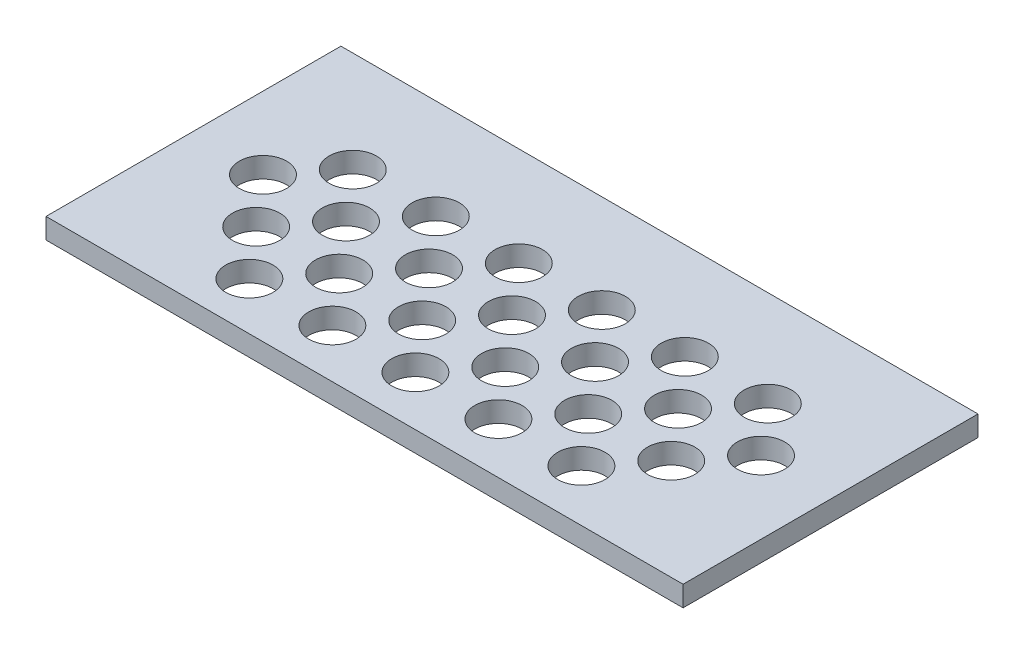
ISO-10303-21;
HEADER;
FILE_DESCRIPTION(('STEP AP214'),'2;1');
FILE_NAME('part.step','',(''),(''),'','','');
FILE_SCHEMA(('AUTOMOTIVE_DESIGN { 1 0 10303 214 1 1 1 1 }'));
ENDSEC;
DATA;
#1=APPLICATION_CONTEXT('core data for automotive mechanical design processes');
#2=APPLICATION_PROTOCOL_DEFINITION('international standard','automotive_design',2000,#1);
#3=PRODUCT_CONTEXT('',#1,'mechanical');
#4=PRODUCT('Part','Part','',(#3));
#5=PRODUCT_RELATED_PRODUCT_CATEGORY('part','',(#4));
#6=PRODUCT_DEFINITION_FORMATION('','',#4);
#7=PRODUCT_DEFINITION_CONTEXT('part definition',#1,'design');
#8=PRODUCT_DEFINITION('design','',#6,#7);
#9=PRODUCT_DEFINITION_SHAPE('','',#8);
#10=(LENGTH_UNIT() NAMED_UNIT(*) SI_UNIT(.MILLI.,.METRE.));
#11=(NAMED_UNIT(*) PLANE_ANGLE_UNIT() SI_UNIT($,.RADIAN.));
#12=(NAMED_UNIT(*) SI_UNIT($,.STERADIAN.) SOLID_ANGLE_UNIT());
#13=UNCERTAINTY_MEASURE_WITH_UNIT(LENGTH_MEASURE(1.E-05),#10,'distance_accuracy_value','');
#14=(GEOMETRIC_REPRESENTATION_CONTEXT(3) GLOBAL_UNCERTAINTY_ASSIGNED_CONTEXT((#13)) GLOBAL_UNIT_ASSIGNED_CONTEXT((#10,
#11,#12)) REPRESENTATION_CONTEXT('',''));
#15=CARTESIAN_POINT('',(0.,0.,0.));
#16=DIRECTION('',(0.,0.,1.));
#17=DIRECTION('',(1.,0.,0.));
#18=AXIS2_PLACEMENT_3D('',#15,#16,#17);
#19=CARTESIAN_POINT('',(155.547079608468,10.,-72.0079934780525));
#20=DIRECTION('',(-1.,0.,0.));
#21=DIRECTION('',(0.,0.,1.));
#22=AXIS2_PLACEMENT_3D('',#19,#20,#21);
#23=PLANE('',#22);
#24=DIRECTION('',(0.,0.,-1.));
#25=VECTOR('',#24,1.);
#26=CARTESIAN_POINT('',(155.547079608468,0.,-72.0079934780525));
#27=LINE('',#26,#25);
#28=CARTESIAN_POINT('',(155.547079608468,0.,72.0079934780525));
#29=VERTEX_POINT('',#28);
#30=CARTESIAN_POINT('',(155.547079608468,0.,-72.0079934780525));
#31=VERTEX_POINT('',#30);
#32=EDGE_CURVE('E96',#29,#31,#27,.T.);
#33=ORIENTED_EDGE('',*,*,#32,.T.);
#34=DIRECTION('',(0.,-1.,0.));
#35=VECTOR('',#34,1.);
#36=CARTESIAN_POINT('',(155.547079608468,10.,-72.0079934780525));
#37=LINE('',#36,#35);
#38=CARTESIAN_POINT('',(155.547079608468,10.,-72.0079934780525));
#39=VERTEX_POINT('',#38);
#40=EDGE_CURVE('E11',#39,#31,#37,.T.);
#41=ORIENTED_EDGE('',*,*,#40,.F.);
#42=DIRECTION('',(0.,0.,-1.));
#43=VECTOR('',#42,1.);
#44=CARTESIAN_POINT('',(155.547079608468,10.,-72.0079934780525));
#45=LINE('',#44,#43);
#46=CARTESIAN_POINT('',(155.547079608468,10.,72.0079934780525));
#47=VERTEX_POINT('',#46);
#48=EDGE_CURVE('E84',#47,#39,#45,.T.);
#49=ORIENTED_EDGE('',*,*,#48,.F.);
#50=DIRECTION('',(0.,-1.,0.));
#51=VECTOR('',#50,1.);
#52=CARTESIAN_POINT('',(155.547079608468,10.,72.0079934780525));
#53=LINE('',#52,#51);
#54=EDGE_CURVE('E92',#47,#29,#53,.T.);
#55=ORIENTED_EDGE('',*,*,#54,.T.);
#56=EDGE_LOOP('',(#33,#41,#49,#55));
#57=FACE_BOUND('',#56,.T.);
#58=ADVANCED_FACE('F33',(#57),#23,.F.);
#59=CARTESIAN_POINT('',(-155.547079608468,10.,-72.0079934780525));
#60=DIRECTION('',(0.,0.,1.));
#61=DIRECTION('',(1.,0.,0.));
#62=AXIS2_PLACEMENT_3D('',#59,#60,#61);
#63=PLANE('',#62);
#64=DIRECTION('',(-1.,0.,0.));
#65=VECTOR('',#64,1.);
#66=CARTESIAN_POINT('',(-155.547079608468,0.,-72.0079934780525));
#67=LINE('',#66,#65);
#68=CARTESIAN_POINT('',(-155.547079608468,0.,-72.0079934780525));
#69=VERTEX_POINT('',#68);
#70=EDGE_CURVE('E88',#31,#69,#67,.T.);
#71=ORIENTED_EDGE('',*,*,#70,.T.);
#72=DIRECTION('',(0.,-1.,0.));
#73=VECTOR('',#72,1.);
#74=CARTESIAN_POINT('',(-155.547079608468,10.,-72.0079934780525));
#75=LINE('',#74,#73);
#76=CARTESIAN_POINT('',(-155.547079608468,10.,-72.0079934780525));
#77=VERTEX_POINT('',#76);
#78=EDGE_CURVE('E41',#77,#69,#75,.T.);
#79=ORIENTED_EDGE('',*,*,#78,.F.);
#80=DIRECTION('',(-1.,0.,0.));
#81=VECTOR('',#80,1.);
#82=CARTESIAN_POINT('',(-155.547079608468,10.,-72.0079934780525));
#83=LINE('',#82,#81);
#84=EDGE_CURVE('E79',#39,#77,#83,.T.);
#85=ORIENTED_EDGE('',*,*,#84,.F.);
#86=ORIENTED_EDGE('',*,*,#40,.T.);
#87=EDGE_LOOP('',(#71,#79,#85,#86));
#88=FACE_BOUND('',#87,.T.);
#89=ADVANCED_FACE('F87',(#88),#63,.F.);
#90=CARTESIAN_POINT('',(-155.547079608468,10.,-72.0079934780525));
#91=DIRECTION('',(1.,0.,0.));
#92=DIRECTION('',(0.,0.,-1.));
#93=AXIS2_PLACEMENT_3D('',#90,#91,#92);
#94=PLANE('',#93);
#95=DIRECTION('',(0.,0.,1.));
#96=VECTOR('',#95,1.);
#97=CARTESIAN_POINT('',(-155.547079608468,0.,-72.0079934780525));
#98=LINE('',#97,#96);
#99=CARTESIAN_POINT('',(-155.547079608468,0.,72.0079934780525));
#100=VERTEX_POINT('',#99);
#101=EDGE_CURVE('E66',#69,#100,#98,.T.);
#102=ORIENTED_EDGE('',*,*,#101,.T.);
#103=DIRECTION('',(0.,-1.,0.));
#104=VECTOR('',#103,1.);
#105=CARTESIAN_POINT('',(-155.547079608468,10.,72.0079934780525));
#106=LINE('',#105,#104);
#107=CARTESIAN_POINT('',(-155.547079608468,10.,72.0079934780525));
#108=VERTEX_POINT('',#107);
#109=EDGE_CURVE('E89',#108,#100,#106,.T.);
#110=ORIENTED_EDGE('',*,*,#109,.F.);
#111=DIRECTION('',(0.,0.,1.));
#112=VECTOR('',#111,1.);
#113=CARTESIAN_POINT('',(-155.547079608468,10.,-72.0079934780525));
#114=LINE('',#113,#112);
#115=EDGE_CURVE('E82',#77,#108,#114,.T.);
#116=ORIENTED_EDGE('',*,*,#115,.F.);
#117=ORIENTED_EDGE('',*,*,#78,.T.);
#118=EDGE_LOOP('',(#102,#110,#116,#117));
#119=FACE_BOUND('',#118,.T.);
#120=ADVANCED_FACE('F90',(#119),#94,.F.);
#121=CARTESIAN_POINT('',(-155.547079608468,10.,72.0079934780525));
#122=DIRECTION('',(0.,0.,-1.));
#123=DIRECTION('',(-1.,0.,0.));
#124=AXIS2_PLACEMENT_3D('',#121,#122,#123);
#125=PLANE('',#124);
#126=DIRECTION('',(1.,0.,0.));
#127=VECTOR('',#126,1.);
#128=CARTESIAN_POINT('',(-155.547079608468,0.,72.0079934780525));
#129=LINE('',#128,#127);
#130=EDGE_CURVE('E72',#100,#29,#129,.T.);
#131=ORIENTED_EDGE('',*,*,#130,.T.);
#132=ORIENTED_EDGE('',*,*,#54,.F.);
#133=DIRECTION('',(1.,0.,0.));
#134=VECTOR('',#133,1.);
#135=CARTESIAN_POINT('',(-155.547079608468,10.,72.0079934780525));
#136=LINE('',#135,#134);
#137=EDGE_CURVE('E49',#108,#47,#136,.T.);
#138=ORIENTED_EDGE('',*,*,#137,.F.);
#139=ORIENTED_EDGE('',*,*,#109,.T.);
#140=EDGE_LOOP('',(#131,#132,#138,#139));
#141=FACE_BOUND('',#140,.T.);
#142=ADVANCED_FACE('F104',(#141),#125,.F.);
#143=CARTESIAN_POINT('',(0.,10.,0.));
#144=DIRECTION('',(0.,1.,0.));
#145=DIRECTION('',(0.,0.,1.));
#146=AXIS2_PLACEMENT_3D('',#143,#144,#145);
#147=PLANE('',#146);
#148=CARTESIAN_POINT('',(0.567478782639692,10.,47.7391525895615));
#149=DIRECTION('',(0.,1.,0.));
#150=DIRECTION('',(0.,0.,1.));
#151=AXIS2_PLACEMENT_3D('',#148,#149,#150);
#152=CIRCLE('',#151,11.561372412777);
#153=CARTESIAN_POINT('',(0.567478782639692,10.,59.3005250023385));
#154=VERTEX_POINT('',#153);
#155=EDGE_CURVE('E182',#154,#154,#152,.T.);
#156=ORIENTED_EDGE('',*,*,#155,.F.);
#157=EDGE_LOOP('',(#156));
#158=FACE_BOUND('',#157,.T.);
#159=CARTESIAN_POINT('',(19.7452132739886,10.,-24.1076619133877));
#160=DIRECTION('',(0.,1.,0.));
#161=DIRECTION('',(0.,0.,1.));
#162=AXIS2_PLACEMENT_3D('',#159,#160,#161);
#163=CIRCLE('',#162,11.561372412777);
#164=CARTESIAN_POINT('',(19.7452132739886,10.,-12.5462895006106));
#165=VERTEX_POINT('',#164);
#166=EDGE_CURVE('E189',#165,#165,#163,.T.);
#167=ORIENTED_EDGE('',*,*,#166,.F.);
#168=EDGE_LOOP('',(#167));
#169=FACE_BOUND('',#168,.T.);
#170=CARTESIAN_POINT('',(-19.7452132739885,10.,24.1076619133877));
#171=DIRECTION('',(0.,1.,0.));
#172=DIRECTION('',(0.,0.,1.));
#173=AXIS2_PLACEMENT_3D('',#170,#171,#172);
#174=CIRCLE('',#173,11.561372412777);
#175=CARTESIAN_POINT('',(-19.7452132739885,10.,35.6690343261647));
#176=VERTEX_POINT('',#175);
#177=EDGE_CURVE('E170',#176,#176,#174,.T.);
#178=ORIENTED_EDGE('',*,*,#177,.F.);
#179=EDGE_LOOP('',(#178));
#180=FACE_BOUND('',#179,.T.);
#181=CARTESIAN_POINT('',(-39.4904265479771,10.,48.2153238267754));
#182=DIRECTION('',(0.,1.,0.));
#183=DIRECTION('',(0.,0.,1.));
#184=AXIS2_PLACEMENT_3D('',#181,#182,#183);
#185=CIRCLE('',#184,11.561372412777);
#186=CARTESIAN_POINT('',(-39.4904265479771,10.,59.7766962395524));
#187=VERTEX_POINT('',#186);
#188=EDGE_CURVE('E177',#187,#187,#185,.T.);
#189=ORIENTED_EDGE('',*,*,#188,.F.);
#190=EDGE_LOOP('',(#189));
#191=FACE_BOUND('',#190,.T.);
#192=CARTESIAN_POINT('',(40.6253841132565,10.,47.2629813523476));
#193=DIRECTION('',(0.,1.,0.));
#194=DIRECTION('',(0.,0.,1.));
#195=AXIS2_PLACEMENT_3D('',#192,#193,#194);
#196=CIRCLE('',#195,11.561372412777);
#197=CARTESIAN_POINT('',(40.6253841132565,10.,58.8243537651247));
#198=VERTEX_POINT('',#197);
#199=EDGE_CURVE('E206',#198,#198,#196,.T.);
#200=ORIENTED_EDGE('',*,*,#199,.F.);
#201=EDGE_LOOP('',(#200));
#202=FACE_BOUND('',#201,.T.);
#203=CARTESIAN_POINT('',(59.8031186046053,10.,-24.5838331506015));
#204=DIRECTION('',(0.,1.,0.));
#205=DIRECTION('',(0.,0.,1.));
#206=AXIS2_PLACEMENT_3D('',#203,#204,#205);
#207=CIRCLE('',#206,11.561372412777);
#208=CARTESIAN_POINT('',(59.8031186046053,10.,-13.0224607378245));
#209=VERTEX_POINT('',#208);
#210=EDGE_CURVE('E213',#209,#209,#207,.T.);
#211=ORIENTED_EDGE('',*,*,#210,.F.);
#212=EDGE_LOOP('',(#211));
#213=FACE_BOUND('',#212,.T.);
#214=CARTESIAN_POINT('',(40.0579053306168,10.,-0.47617123721384));
#215=DIRECTION('',(0.,1.,0.));
#216=DIRECTION('',(0.,0.,1.));
#217=AXIS2_PLACEMENT_3D('',#214,#215,#216);
#218=CIRCLE('',#217,11.561372412777);
#219=CARTESIAN_POINT('',(40.0579053306168,10.,11.0852011755632));
#220=VERTEX_POINT('',#219);
#221=EDGE_CURVE('E194',#220,#220,#218,.T.);
#222=ORIENTED_EDGE('',*,*,#221,.F.);
#223=EDGE_LOOP('',(#222));
#224=FACE_BOUND('',#223,.T.);
#225=CARTESIAN_POINT('',(20.3126920566282,10.,23.6314906761738));
#226=DIRECTION('',(0.,1.,0.));
#227=DIRECTION('',(0.,0.,1.));
#228=AXIS2_PLACEMENT_3D('',#225,#226,#227);
#229=CIRCLE('',#228,11.561372412777);
#230=CARTESIAN_POINT('',(20.3126920566282,10.,35.1928630889508));
#231=VERTEX_POINT('',#230);
#232=EDGE_CURVE('E201',#231,#231,#229,.T.);
#233=ORIENTED_EDGE('',*,*,#232,.F.);
#234=EDGE_LOOP('',(#233));
#235=FACE_BOUND('',#234,.T.);
#236=CARTESIAN_POINT('',(-60.370597387245,10.,-23.1553194389599));
#237=DIRECTION('',(0.,1.,0.));
#238=DIRECTION('',(0.,0.,1.));
#239=AXIS2_PLACEMENT_3D('',#236,#237,#238);
#240=CIRCLE('',#239,11.561372412777);
#241=CARTESIAN_POINT('',(-60.370597387245,10.,-11.5939470261829));
#242=VERTEX_POINT('',#241);
#243=EDGE_CURVE('E134',#242,#242,#240,.T.);
#244=ORIENTED_EDGE('',*,*,#243,.F.);
#245=EDGE_LOOP('',(#244));
#246=FACE_BOUND('',#245,.T.);
#247=CARTESIAN_POINT('',(-80.1158106612335,10.,0.952342474427732));
#248=DIRECTION('',(0.,1.,0.));
#249=DIRECTION('',(0.,0.,1.));
#250=AXIS2_PLACEMENT_3D('',#247,#248,#249);
#251=CIRCLE('',#250,11.561372412777);
#252=CARTESIAN_POINT('',(-80.1158106612335,10.,12.5137148872047));
#253=VERTEX_POINT('',#252);
#254=EDGE_CURVE('E141',#253,#253,#251,.T.);
#255=ORIENTED_EDGE('',*,*,#254,.F.);
#256=EDGE_LOOP('',(#255));
#257=FACE_BOUND('',#256,.T.);
#258=CARTESIAN_POINT('',(-99.8610239352221,10.,25.0600043878154));
#259=DIRECTION('',(0.,1.,0.));
#260=DIRECTION('',(0.,0.,1.));
#261=AXIS2_PLACEMENT_3D('',#258,#259,#260);
#262=CIRCLE('',#261,11.561372412777);
#263=CARTESIAN_POINT('',(-99.8610239352221,10.,36.6213768005924));
#264=VERTEX_POINT('',#263);
#265=EDGE_CURVE('E122',#264,#264,#262,.T.);
#266=ORIENTED_EDGE('',*,*,#265,.F.);
#267=EDGE_LOOP('',(#266));
#268=FACE_BOUND('',#267,.T.);
#269=CARTESIAN_POINT('',(-100.428502717862,10.,-22.6791482017461));
#270=DIRECTION('',(0.,1.,0.));
#271=DIRECTION('',(0.,0.,1.));
#272=AXIS2_PLACEMENT_3D('',#269,#270,#271);
#273=CIRCLE('',#272,11.561372412777);
#274=CARTESIAN_POINT('',(-100.428502717862,10.,-11.117775788969));
#275=VERTEX_POINT('',#274);
#276=EDGE_CURVE('E129',#275,#275,#273,.T.);
#277=ORIENTED_EDGE('',*,*,#276,.F.);
#278=EDGE_LOOP('',(#277));
#279=FACE_BOUND('',#278,.T.);
#280=CARTESIAN_POINT('',(-79.5483318785938,10.,48.6914950639892));
#281=DIRECTION('',(0.,1.,0.));
#282=DIRECTION('',(0.,0.,1.));
#283=AXIS2_PLACEMENT_3D('',#280,#281,#282);
#284=CIRCLE('',#283,11.561372412777);
#285=CARTESIAN_POINT('',(-79.5483318785938,10.,60.2528674767662));
#286=VERTEX_POINT('',#285);
#287=EDGE_CURVE('E165',#286,#286,#284,.T.);
#288=ORIENTED_EDGE('',*,*,#287,.F.);
#289=EDGE_LOOP('',(#288));
#290=FACE_BOUND('',#289,.T.);
#291=CARTESIAN_POINT('',(-59.8031186046053,10.,24.5838331506015));
#292=DIRECTION('',(0.,1.,0.));
#293=DIRECTION('',(0.,0.,1.));
#294=AXIS2_PLACEMENT_3D('',#291,#292,#293);
#295=CIRCLE('',#294,11.561372412777);
#296=CARTESIAN_POINT('',(-59.8031186046053,10.,36.1452055633786));
#297=VERTEX_POINT('',#296);
#298=EDGE_CURVE('E159',#297,#297,#295,.T.);
#299=ORIENTED_EDGE('',*,*,#298,.F.);
#300=EDGE_LOOP('',(#299));
#301=FACE_BOUND('',#300,.T.);
#302=CARTESIAN_POINT('',(-40.0579053306168,10.,0.476171237213874));
#303=DIRECTION('',(0.,1.,0.));
#304=DIRECTION('',(0.,0.,1.));
#305=AXIS2_PLACEMENT_3D('',#302,#303,#304);
#306=CIRCLE('',#305,11.561372412777);
#307=CARTESIAN_POINT('',(-40.0579053306168,10.,12.0375436499909));
#308=VERTEX_POINT('',#307);
#309=EDGE_CURVE('E153',#308,#308,#306,.T.);
#310=ORIENTED_EDGE('',*,*,#309,.F.);
#311=EDGE_LOOP('',(#310));
#312=FACE_BOUND('',#311,.T.);
#313=CARTESIAN_POINT('',(-20.3126920566282,10.,-23.6314906761738));
#314=DIRECTION('',(0.,1.,0.));
#315=DIRECTION('',(0.,0.,1.));
#316=AXIS2_PLACEMENT_3D('',#313,#314,#315);
#317=CIRCLE('',#316,11.561372412777);
#318=CARTESIAN_POINT('',(-20.3126920566282,10.,-12.0701182633968));
#319=VERTEX_POINT('',#318);
#320=EDGE_CURVE('E146',#319,#319,#317,.T.);
#321=ORIENTED_EDGE('',*,*,#320,.F.);
#322=EDGE_LOOP('',(#321));
#323=FACE_BOUND('',#322,.T.);
#324=CARTESIAN_POINT('',(120.17371599185,10.,-1.42851371164155));
#325=DIRECTION('',(0.,1.,0.));
#326=DIRECTION('',(0.,0.,1.));
#327=AXIS2_PLACEMENT_3D('',#324,#325,#326);
#328=CIRCLE('',#327,11.561372412777);
#329=CARTESIAN_POINT('',(120.17371599185,10.,10.1328587011355));
#330=VERTEX_POINT('',#329);
#331=EDGE_CURVE('E242',#330,#330,#328,.T.);
#332=ORIENTED_EDGE('',*,*,#331,.F.);
#333=EDGE_LOOP('',(#332));
#334=FACE_BOUND('',#333,.T.);
#335=CARTESIAN_POINT('',(100.428502717862,10.,22.6791482017461));
#336=DIRECTION('',(0.,1.,0.));
#337=DIRECTION('',(0.,0.,1.));
#338=AXIS2_PLACEMENT_3D('',#335,#336,#337);
#339=CIRCLE('',#338,11.561372412777);
#340=CARTESIAN_POINT('',(100.428502717862,10.,34.2405206145231));
#341=VERTEX_POINT('',#340);
#342=EDGE_CURVE('E248',#341,#341,#339,.T.);
#343=ORIENTED_EDGE('',*,*,#342,.F.);
#344=EDGE_LOOP('',(#343));
#345=FACE_BOUND('',#344,.T.);
#346=CARTESIAN_POINT('',(60.370597387245,10.,23.15531943896));
#347=DIRECTION('',(0.,1.,0.));
#348=DIRECTION('',(0.,0.,1.));
#349=AXIS2_PLACEMENT_3D('',#346,#347,#348);
#350=CIRCLE('',#349,11.561372412777);
#351=CARTESIAN_POINT('',(60.370597387245,10.,34.716691851737));
#352=VERTEX_POINT('',#351);
#353=EDGE_CURVE('E225',#352,#352,#350,.T.);
#354=ORIENTED_EDGE('',*,*,#353,.F.);
#355=EDGE_LOOP('',(#354));
#356=FACE_BOUND('',#355,.T.);
#357=CARTESIAN_POINT('',(80.1158106612336,10.,-0.952342474427697));
#358=DIRECTION('',(0.,1.,0.));
#359=DIRECTION('',(0.,0.,1.));
#360=AXIS2_PLACEMENT_3D('',#357,#358,#359);
#361=CIRCLE('',#360,11.561372412777);
#362=CARTESIAN_POINT('',(80.1158106612336,10.,10.6090299383493));
#363=VERTEX_POINT('',#362);
#364=EDGE_CURVE('E218',#363,#363,#361,.T.);
#365=ORIENTED_EDGE('',*,*,#364,.F.);
#366=EDGE_LOOP('',(#365));
#367=FACE_BOUND('',#366,.T.);
#368=CARTESIAN_POINT('',(99.8610239352221,10.,-25.0600043878154));
#369=DIRECTION('',(0.,1.,0.));
#370=DIRECTION('',(0.,0.,1.));
#371=AXIS2_PLACEMENT_3D('',#368,#369,#370);
#372=CIRCLE('',#371,11.561372412777);
#373=CARTESIAN_POINT('',(99.8610239352221,10.,-13.4986319750384));
#374=VERTEX_POINT('',#373);
#375=EDGE_CURVE('E237',#374,#374,#372,.T.);
#376=ORIENTED_EDGE('',*,*,#375,.F.);
#377=EDGE_LOOP('',(#376));
#378=FACE_BOUND('',#377,.T.);
#379=CARTESIAN_POINT('',(80.6832894438732,10.,46.7868101151338));
#380=DIRECTION('',(0.,1.,0.));
#381=DIRECTION('',(0.,0.,1.));
#382=AXIS2_PLACEMENT_3D('',#379,#380,#381);
#383=CIRCLE('',#382,11.561372412777);
#384=CARTESIAN_POINT('',(80.6832894438732,10.,58.3481825279108));
#385=VERTEX_POINT('',#384);
#386=EDGE_CURVE('E230',#385,#385,#383,.T.);
#387=ORIENTED_EDGE('',*,*,#386,.F.);
#388=EDGE_LOOP('',(#387));
#389=FACE_BOUND('',#388,.T.);
#390=CARTESIAN_POINT('',(-120.17371599185,10.,1.42851371164161));
#391=DIRECTION('',(0.,1.,0.));
#392=DIRECTION('',(0.,0.,1.));
#393=AXIS2_PLACEMENT_3D('',#390,#391,#392);
#394=CIRCLE('',#393,11.561372412777);
#395=CARTESIAN_POINT('',(-120.17371599185,10.,12.9898861244186));
#396=VERTEX_POINT('',#395);
#397=EDGE_CURVE('E116',#396,#396,#394,.T.);
#398=ORIENTED_EDGE('',*,*,#397,.F.);
#399=EDGE_LOOP('',(#398));
#400=FACE_BOUND('',#399,.T.);
#401=CARTESIAN_POINT('',(0.,10.,0.));
#402=DIRECTION('',(0.,1.,0.));
#403=DIRECTION('',(0.,0.,1.));
#404=AXIS2_PLACEMENT_3D('',#401,#402,#403);
#405=CIRCLE('',#404,11.561372412777);
#406=CARTESIAN_POINT('',(0.,10.,11.561372412777));
#407=VERTEX_POINT('',#406);
#408=EDGE_CURVE('E110',#407,#407,#405,.T.);
#409=ORIENTED_EDGE('',*,*,#408,.F.);
#410=EDGE_LOOP('',(#409));
#411=FACE_BOUND('',#410,.T.);
#412=ORIENTED_EDGE('',*,*,#48,.T.);
#413=ORIENTED_EDGE('',*,*,#84,.T.);
#414=ORIENTED_EDGE('',*,*,#115,.T.);
#415=ORIENTED_EDGE('',*,*,#137,.T.);
#416=EDGE_LOOP('',(#412,#413,#414,#415));
#417=FACE_BOUND('',#416,.T.);
#418=ADVANCED_FACE('F80',(#158,#169,#180,#191,#202,#213,#224,#235,#246,#257,#268,#279,#290,#301,
#312,#323,#334,#345,#356,#367,#378,#389,#400,#411,#417),#147,.T.);
#419=CARTESIAN_POINT('',(0.,0.,0.));
#420=DIRECTION('',(0.,1.,0.));
#421=DIRECTION('',(0.,0.,1.));
#422=AXIS2_PLACEMENT_3D('',#419,#420,#421);
#423=PLANE('',#422);
#424=CARTESIAN_POINT('',(0.567478782639692,0.,47.7391525895615));
#425=DIRECTION('',(0.,1.,0.));
#426=DIRECTION('',(0.,0.,1.));
#427=AXIS2_PLACEMENT_3D('',#424,#425,#426);
#428=CIRCLE('',#427,11.561372412777);
#429=CARTESIAN_POINT('',(0.567478782639692,0.,59.3005250023385));
#430=VERTEX_POINT('',#429);
#431=EDGE_CURVE('E185',#430,#430,#428,.T.);
#432=ORIENTED_EDGE('',*,*,#431,.T.);
#433=EDGE_LOOP('',(#432));
#434=FACE_BOUND('',#433,.T.);
#435=CARTESIAN_POINT('',(19.7452132739886,0.,-24.1076619133877));
#436=DIRECTION('',(0.,1.,0.));
#437=DIRECTION('',(0.,0.,1.));
#438=AXIS2_PLACEMENT_3D('',#435,#436,#437);
#439=CIRCLE('',#438,11.561372412777);
#440=CARTESIAN_POINT('',(19.7452132739886,0.,-12.5462895006106));
#441=VERTEX_POINT('',#440);
#442=EDGE_CURVE('E174',#441,#441,#439,.T.);
#443=ORIENTED_EDGE('',*,*,#442,.T.);
#444=EDGE_LOOP('',(#443));
#445=FACE_BOUND('',#444,.T.);
#446=CARTESIAN_POINT('',(-19.7452132739885,0.,24.1076619133877));
#447=DIRECTION('',(0.,1.,0.));
#448=DIRECTION('',(0.,0.,1.));
#449=AXIS2_PLACEMENT_3D('',#446,#447,#448);
#450=CIRCLE('',#449,11.561372412777);
#451=CARTESIAN_POINT('',(-19.7452132739885,0.,35.6690343261647));
#452=VERTEX_POINT('',#451);
#453=EDGE_CURVE('E173',#452,#452,#450,.T.);
#454=ORIENTED_EDGE('',*,*,#453,.T.);
#455=EDGE_LOOP('',(#454));
#456=FACE_BOUND('',#455,.T.);
#457=CARTESIAN_POINT('',(-39.4904265479771,0.,48.2153238267754));
#458=DIRECTION('',(0.,1.,0.));
#459=DIRECTION('',(0.,0.,1.));
#460=AXIS2_PLACEMENT_3D('',#457,#458,#459);
#461=CIRCLE('',#460,11.561372412777);
#462=CARTESIAN_POINT('',(-39.4904265479771,0.,59.7766962395524));
#463=VERTEX_POINT('',#462);
#464=EDGE_CURVE('E150',#463,#463,#461,.T.);
#465=ORIENTED_EDGE('',*,*,#464,.T.);
#466=EDGE_LOOP('',(#465));
#467=FACE_BOUND('',#466,.T.);
#468=CARTESIAN_POINT('',(40.6253841132565,0.,47.2629813523476));
#469=DIRECTION('',(0.,1.,0.));
#470=DIRECTION('',(0.,0.,1.));
#471=AXIS2_PLACEMENT_3D('',#468,#469,#470);
#472=CIRCLE('',#471,11.561372412777);
#473=CARTESIAN_POINT('',(40.6253841132565,0.,58.8243537651247));
#474=VERTEX_POINT('',#473);
#475=EDGE_CURVE('E209',#474,#474,#472,.T.);
#476=ORIENTED_EDGE('',*,*,#475,.T.);
#477=EDGE_LOOP('',(#476));
#478=FACE_BOUND('',#477,.T.);
#479=CARTESIAN_POINT('',(59.8031186046053,0.,-24.5838331506015));
#480=DIRECTION('',(0.,1.,0.));
#481=DIRECTION('',(0.,0.,1.));
#482=AXIS2_PLACEMENT_3D('',#479,#480,#481);
#483=CIRCLE('',#482,11.561372412777);
#484=CARTESIAN_POINT('',(59.8031186046053,0.,-13.0224607378245));
#485=VERTEX_POINT('',#484);
#486=EDGE_CURVE('E198',#485,#485,#483,.T.);
#487=ORIENTED_EDGE('',*,*,#486,.T.);
#488=EDGE_LOOP('',(#487));
#489=FACE_BOUND('',#488,.T.);
#490=CARTESIAN_POINT('',(40.0579053306168,0.,-0.47617123721384));
#491=DIRECTION('',(0.,1.,0.));
#492=DIRECTION('',(0.,0.,1.));
#493=AXIS2_PLACEMENT_3D('',#490,#491,#492);
#494=CIRCLE('',#493,11.561372412777);
#495=CARTESIAN_POINT('',(40.0579053306168,0.,11.0852011755632));
#496=VERTEX_POINT('',#495);
#497=EDGE_CURVE('E197',#496,#496,#494,.T.);
#498=ORIENTED_EDGE('',*,*,#497,.T.);
#499=EDGE_LOOP('',(#498));
#500=FACE_BOUND('',#499,.T.);
#501=CARTESIAN_POINT('',(20.3126920566282,0.,23.6314906761738));
#502=DIRECTION('',(0.,1.,0.));
#503=DIRECTION('',(0.,0.,1.));
#504=AXIS2_PLACEMENT_3D('',#501,#502,#503);
#505=CIRCLE('',#504,11.561372412777);
#506=CARTESIAN_POINT('',(20.3126920566282,0.,35.1928630889508));
#507=VERTEX_POINT('',#506);
#508=EDGE_CURVE('E186',#507,#507,#505,.T.);
#509=ORIENTED_EDGE('',*,*,#508,.T.);
#510=EDGE_LOOP('',(#509));
#511=FACE_BOUND('',#510,.T.);
#512=CARTESIAN_POINT('',(-60.370597387245,0.,-23.1553194389599));
#513=DIRECTION('',(0.,1.,0.));
#514=DIRECTION('',(0.,0.,1.));
#515=AXIS2_PLACEMENT_3D('',#512,#513,#514);
#516=CIRCLE('',#515,11.561372412777);
#517=CARTESIAN_POINT('',(-60.370597387245,0.,-11.5939470261829));
#518=VERTEX_POINT('',#517);
#519=EDGE_CURVE('E137',#518,#518,#516,.T.);
#520=ORIENTED_EDGE('',*,*,#519,.T.);
#521=EDGE_LOOP('',(#520));
#522=FACE_BOUND('',#521,.T.);
#523=CARTESIAN_POINT('',(-80.1158106612335,0.,0.952342474427732));
#524=DIRECTION('',(0.,1.,0.));
#525=DIRECTION('',(0.,0.,1.));
#526=AXIS2_PLACEMENT_3D('',#523,#524,#525);
#527=CIRCLE('',#526,11.561372412777);
#528=CARTESIAN_POINT('',(-80.1158106612335,0.,12.5137148872047));
#529=VERTEX_POINT('',#528);
#530=EDGE_CURVE('E126',#529,#529,#527,.T.);
#531=ORIENTED_EDGE('',*,*,#530,.T.);
#532=EDGE_LOOP('',(#531));
#533=FACE_BOUND('',#532,.T.);
#534=CARTESIAN_POINT('',(-99.8610239352221,0.,25.0600043878154));
#535=DIRECTION('',(0.,1.,0.));
#536=DIRECTION('',(0.,0.,1.));
#537=AXIS2_PLACEMENT_3D('',#534,#535,#536);
#538=CIRCLE('',#537,11.561372412777);
#539=CARTESIAN_POINT('',(-99.8610239352221,0.,36.6213768005924));
#540=VERTEX_POINT('',#539);
#541=EDGE_CURVE('E125',#540,#540,#538,.T.);
#542=ORIENTED_EDGE('',*,*,#541,.T.);
#543=EDGE_LOOP('',(#542));
#544=FACE_BOUND('',#543,.T.);
#545=CARTESIAN_POINT('',(-100.428502717862,0.,-22.6791482017461));
#546=DIRECTION('',(0.,1.,0.));
#547=DIRECTION('',(0.,0.,1.));
#548=AXIS2_PLACEMENT_3D('',#545,#546,#547);
#549=CIRCLE('',#548,11.561372412777);
#550=CARTESIAN_POINT('',(-100.428502717862,0.,-11.117775788969));
#551=VERTEX_POINT('',#550);
#552=EDGE_CURVE('E119',#551,#551,#549,.T.);
#553=ORIENTED_EDGE('',*,*,#552,.T.);
#554=EDGE_LOOP('',(#553));
#555=FACE_BOUND('',#554,.T.);
#556=CARTESIAN_POINT('',(-79.5483318785938,0.,48.6914950639892));
#557=DIRECTION('',(0.,1.,0.));
#558=DIRECTION('',(0.,0.,1.));
#559=AXIS2_PLACEMENT_3D('',#556,#557,#558);
#560=CIRCLE('',#559,11.561372412777);
#561=CARTESIAN_POINT('',(-79.5483318785938,0.,60.2528674767662));
#562=VERTEX_POINT('',#561);
#563=EDGE_CURVE('E138',#562,#562,#560,.T.);
#564=ORIENTED_EDGE('',*,*,#563,.T.);
#565=EDGE_LOOP('',(#564));
#566=FACE_BOUND('',#565,.T.);
#567=CARTESIAN_POINT('',(-59.8031186046053,0.,24.5838331506015));
#568=DIRECTION('',(0.,1.,0.));
#569=DIRECTION('',(0.,0.,1.));
#570=AXIS2_PLACEMENT_3D('',#567,#568,#569);
#571=CIRCLE('',#570,11.561372412777);
#572=CARTESIAN_POINT('',(-59.8031186046053,0.,36.1452055633786));
#573=VERTEX_POINT('',#572);
#574=EDGE_CURVE('E162',#573,#573,#571,.T.);
#575=ORIENTED_EDGE('',*,*,#574,.T.);
#576=EDGE_LOOP('',(#575));
#577=FACE_BOUND('',#576,.T.);
#578=CARTESIAN_POINT('',(-40.0579053306168,0.,0.476171237213874));
#579=DIRECTION('',(0.,1.,0.));
#580=DIRECTION('',(0.,0.,1.));
#581=AXIS2_PLACEMENT_3D('',#578,#579,#580);
#582=CIRCLE('',#581,11.561372412777);
#583=CARTESIAN_POINT('',(-40.0579053306168,0.,12.0375436499909));
#584=VERTEX_POINT('',#583);
#585=EDGE_CURVE('E156',#584,#584,#582,.T.);
#586=ORIENTED_EDGE('',*,*,#585,.T.);
#587=EDGE_LOOP('',(#586));
#588=FACE_BOUND('',#587,.T.);
#589=CARTESIAN_POINT('',(-20.3126920566282,0.,-23.6314906761738));
#590=DIRECTION('',(0.,1.,0.));
#591=DIRECTION('',(0.,0.,1.));
#592=AXIS2_PLACEMENT_3D('',#589,#590,#591);
#593=CIRCLE('',#592,11.561372412777);
#594=CARTESIAN_POINT('',(-20.3126920566282,0.,-12.0701182633968));
#595=VERTEX_POINT('',#594);
#596=EDGE_CURVE('E149',#595,#595,#593,.T.);
#597=ORIENTED_EDGE('',*,*,#596,.T.);
#598=EDGE_LOOP('',(#597));
#599=FACE_BOUND('',#598,.T.);
#600=CARTESIAN_POINT('',(120.17371599185,0.,-1.42851371164155));
#601=DIRECTION('',(0.,1.,0.));
#602=DIRECTION('',(0.,0.,1.));
#603=AXIS2_PLACEMENT_3D('',#600,#601,#602);
#604=CIRCLE('',#603,11.561372412777);
#605=CARTESIAN_POINT('',(120.17371599185,0.,10.1328587011355));
#606=VERTEX_POINT('',#605);
#607=EDGE_CURVE('E245',#606,#606,#604,.T.);
#608=ORIENTED_EDGE('',*,*,#607,.T.);
#609=EDGE_LOOP('',(#608));
#610=FACE_BOUND('',#609,.T.);
#611=CARTESIAN_POINT('',(100.428502717862,0.,22.6791482017461));
#612=DIRECTION('',(0.,1.,0.));
#613=DIRECTION('',(0.,0.,1.));
#614=AXIS2_PLACEMENT_3D('',#611,#612,#613);
#615=CIRCLE('',#614,11.561372412777);
#616=CARTESIAN_POINT('',(100.428502717862,0.,34.2405206145231));
#617=VERTEX_POINT('',#616);
#618=EDGE_CURVE('E234',#617,#617,#615,.T.);
#619=ORIENTED_EDGE('',*,*,#618,.T.);
#620=EDGE_LOOP('',(#619));
#621=FACE_BOUND('',#620,.T.);
#622=CARTESIAN_POINT('',(60.370597387245,0.,23.15531943896));
#623=DIRECTION('',(0.,1.,0.));
#624=DIRECTION('',(0.,0.,1.));
#625=AXIS2_PLACEMENT_3D('',#622,#623,#624);
#626=CIRCLE('',#625,11.561372412777);
#627=CARTESIAN_POINT('',(60.370597387245,0.,34.716691851737));
#628=VERTEX_POINT('',#627);
#629=EDGE_CURVE('E210',#628,#628,#626,.T.);
#630=ORIENTED_EDGE('',*,*,#629,.T.);
#631=EDGE_LOOP('',(#630));
#632=FACE_BOUND('',#631,.T.);
#633=CARTESIAN_POINT('',(80.1158106612336,0.,-0.952342474427697));
#634=DIRECTION('',(0.,1.,0.));
#635=DIRECTION('',(0.,0.,1.));
#636=AXIS2_PLACEMENT_3D('',#633,#634,#635);
#637=CIRCLE('',#636,11.561372412777);
#638=CARTESIAN_POINT('',(80.1158106612336,0.,10.6090299383493));
#639=VERTEX_POINT('',#638);
#640=EDGE_CURVE('E221',#639,#639,#637,.T.);
#641=ORIENTED_EDGE('',*,*,#640,.T.);
#642=EDGE_LOOP('',(#641));
#643=FACE_BOUND('',#642,.T.);
#644=CARTESIAN_POINT('',(99.8610239352221,0.,-25.0600043878154));
#645=DIRECTION('',(0.,1.,0.));
#646=DIRECTION('',(0.,0.,1.));
#647=AXIS2_PLACEMENT_3D('',#644,#645,#646);
#648=CIRCLE('',#647,11.561372412777);
#649=CARTESIAN_POINT('',(99.8610239352221,0.,-13.4986319750384));
#650=VERTEX_POINT('',#649);
#651=EDGE_CURVE('E222',#650,#650,#648,.T.);
#652=ORIENTED_EDGE('',*,*,#651,.T.);
#653=EDGE_LOOP('',(#652));
#654=FACE_BOUND('',#653,.T.);
#655=CARTESIAN_POINT('',(80.6832894438732,0.,46.7868101151338));
#656=DIRECTION('',(0.,1.,0.));
#657=DIRECTION('',(0.,0.,1.));
#658=AXIS2_PLACEMENT_3D('',#655,#656,#657);
#659=CIRCLE('',#658,11.561372412777);
#660=CARTESIAN_POINT('',(80.6832894438732,0.,58.3481825279108));
#661=VERTEX_POINT('',#660);
#662=EDGE_CURVE('E233',#661,#661,#659,.T.);
#663=ORIENTED_EDGE('',*,*,#662,.T.);
#664=EDGE_LOOP('',(#663));
#665=FACE_BOUND('',#664,.T.);
#666=CARTESIAN_POINT('',(-120.17371599185,0.,1.42851371164161));
#667=DIRECTION('',(0.,1.,0.));
#668=DIRECTION('',(0.,0.,1.));
#669=AXIS2_PLACEMENT_3D('',#666,#667,#668);
#670=CIRCLE('',#669,11.561372412777);
#671=CARTESIAN_POINT('',(-120.17371599185,0.,12.9898861244186));
#672=VERTEX_POINT('',#671);
#673=EDGE_CURVE('E113',#672,#672,#670,.T.);
#674=ORIENTED_EDGE('',*,*,#673,.T.);
#675=EDGE_LOOP('',(#674));
#676=FACE_BOUND('',#675,.T.);
#677=CARTESIAN_POINT('',(0.,0.,0.));
#678=DIRECTION('',(0.,1.,0.));
#679=DIRECTION('',(0.,0.,1.));
#680=AXIS2_PLACEMENT_3D('',#677,#678,#679);
#681=CIRCLE('',#680,11.561372412777);
#682=CARTESIAN_POINT('',(0.,0.,11.561372412777));
#683=VERTEX_POINT('',#682);
#684=EDGE_CURVE('E99',#683,#683,#681,.T.);
#685=ORIENTED_EDGE('',*,*,#684,.T.);
#686=EDGE_LOOP('',(#685));
#687=FACE_BOUND('',#686,.T.);
#688=ORIENTED_EDGE('',*,*,#32,.F.);
#689=ORIENTED_EDGE('',*,*,#130,.F.);
#690=ORIENTED_EDGE('',*,*,#101,.F.);
#691=ORIENTED_EDGE('',*,*,#70,.F.);
#692=EDGE_LOOP('',(#688,#689,#690,#691));
#693=FACE_BOUND('',#692,.T.);
#694=ADVANCED_FACE('F107',(#434,#445,#456,#467,#478,#489,#500,#511,#522,#533,#544,#555,#566,
#577,#588,#599,#610,#621,#632,#643,#654,#665,#676,#687,#693),#423,.F.);
#695=CARTESIAN_POINT('',(0.,0.,0.));
#696=DIRECTION('',(0.,1.,0.));
#697=DIRECTION('',(0.,0.,1.));
#698=AXIS2_PLACEMENT_3D('',#695,#696,#697);
#699=CYLINDRICAL_SURFACE('',#698,11.561372412777);
#700=ORIENTED_EDGE('',*,*,#684,.F.);
#701=EDGE_LOOP('',(#700));
#702=FACE_BOUND('',#701,.T.);
#703=ORIENTED_EDGE('',*,*,#408,.T.);
#704=EDGE_LOOP('',(#703));
#705=FACE_BOUND('',#704,.T.);
#706=ADVANCED_FACE('F280',(#702,#705),#699,.F.);
#707=CARTESIAN_POINT('',(-120.17371599185,0.,1.42851371164161));
#708=DIRECTION('',(0.,1.,0.));
#709=DIRECTION('',(0.,0.,1.));
#710=AXIS2_PLACEMENT_3D('',#707,#708,#709);
#711=CYLINDRICAL_SURFACE('',#710,11.561372412777);
#712=ORIENTED_EDGE('',*,*,#673,.F.);
#713=EDGE_LOOP('',(#712));
#714=FACE_BOUND('',#713,.T.);
#715=ORIENTED_EDGE('',*,*,#397,.T.);
#716=EDGE_LOOP('',(#715));
#717=FACE_BOUND('',#716,.T.);
#718=ADVANCED_FACE('F282',(#714,#717),#711,.F.);
#719=CARTESIAN_POINT('',(80.6832894438732,0.,46.7868101151338));
#720=DIRECTION('',(0.,1.,0.));
#721=DIRECTION('',(0.,0.,1.));
#722=AXIS2_PLACEMENT_3D('',#719,#720,#721);
#723=CYLINDRICAL_SURFACE('',#722,11.561372412777);
#724=ORIENTED_EDGE('',*,*,#662,.F.);
#725=EDGE_LOOP('',(#724));
#726=FACE_BOUND('',#725,.T.);
#727=ORIENTED_EDGE('',*,*,#386,.T.);
#728=EDGE_LOOP('',(#727));
#729=FACE_BOUND('',#728,.T.);
#730=ADVANCED_FACE('F289',(#726,#729),#723,.F.);
#731=CARTESIAN_POINT('',(99.8610239352221,0.,-25.0600043878154));
#732=DIRECTION('',(0.,1.,0.));
#733=DIRECTION('',(0.,0.,1.));
#734=AXIS2_PLACEMENT_3D('',#731,#732,#733);
#735=CYLINDRICAL_SURFACE('',#734,11.561372412777);
#736=ORIENTED_EDGE('',*,*,#651,.F.);
#737=EDGE_LOOP('',(#736));
#738=FACE_BOUND('',#737,.T.);
#739=ORIENTED_EDGE('',*,*,#375,.T.);
#740=EDGE_LOOP('',(#739));
#741=FACE_BOUND('',#740,.T.);
#742=ADVANCED_FACE('F333',(#738,#741),#735,.F.);
#743=CARTESIAN_POINT('',(80.1158106612336,0.,-0.952342474427697));
#744=DIRECTION('',(0.,1.,0.));
#745=DIRECTION('',(0.,0.,1.));
#746=AXIS2_PLACEMENT_3D('',#743,#744,#745);
#747=CYLINDRICAL_SURFACE('',#746,11.561372412777);
#748=ORIENTED_EDGE('',*,*,#640,.F.);
#749=EDGE_LOOP('',(#748));
#750=FACE_BOUND('',#749,.T.);
#751=ORIENTED_EDGE('',*,*,#364,.T.);
#752=EDGE_LOOP('',(#751));
#753=FACE_BOUND('',#752,.T.);
#754=ADVANCED_FACE('F343',(#750,#753),#747,.F.);
#755=CARTESIAN_POINT('',(60.370597387245,0.,23.15531943896));
#756=DIRECTION('',(0.,1.,0.));
#757=DIRECTION('',(0.,0.,1.));
#758=AXIS2_PLACEMENT_3D('',#755,#756,#757);
#759=CYLINDRICAL_SURFACE('',#758,11.561372412777);
#760=ORIENTED_EDGE('',*,*,#629,.F.);
#761=EDGE_LOOP('',(#760));
#762=FACE_BOUND('',#761,.T.);
#763=ORIENTED_EDGE('',*,*,#353,.T.);
#764=EDGE_LOOP('',(#763));
#765=FACE_BOUND('',#764,.T.);
#766=ADVANCED_FACE('F260',(#762,#765),#759,.F.);
#767=CARTESIAN_POINT('',(100.428502717862,0.,22.6791482017461));
#768=DIRECTION('',(0.,1.,0.));
#769=DIRECTION('',(0.,0.,1.));
#770=AXIS2_PLACEMENT_3D('',#767,#768,#769);
#771=CYLINDRICAL_SURFACE('',#770,11.561372412777);
#772=ORIENTED_EDGE('',*,*,#618,.F.);
#773=EDGE_LOOP('',(#772));
#774=FACE_BOUND('',#773,.T.);
#775=ORIENTED_EDGE('',*,*,#342,.T.);
#776=EDGE_LOOP('',(#775));
#777=FACE_BOUND('',#776,.T.);
#778=ADVANCED_FACE('F256',(#774,#777),#771,.F.);
#779=CARTESIAN_POINT('',(120.17371599185,0.,-1.42851371164155));
#780=DIRECTION('',(0.,1.,0.));
#781=DIRECTION('',(0.,0.,1.));
#782=AXIS2_PLACEMENT_3D('',#779,#780,#781);
#783=CYLINDRICAL_SURFACE('',#782,11.561372412777);
#784=ORIENTED_EDGE('',*,*,#607,.F.);
#785=EDGE_LOOP('',(#784));
#786=FACE_BOUND('',#785,.T.);
#787=ORIENTED_EDGE('',*,*,#331,.T.);
#788=EDGE_LOOP('',(#787));
#789=FACE_BOUND('',#788,.T.);
#790=ADVANCED_FACE('F259',(#786,#789),#783,.F.);
#791=CARTESIAN_POINT('',(-20.3126920566282,0.,-23.6314906761738));
#792=DIRECTION('',(0.,1.,0.));
#793=DIRECTION('',(0.,0.,1.));
#794=AXIS2_PLACEMENT_3D('',#791,#792,#793);
#795=CYLINDRICAL_SURFACE('',#794,11.561372412777);
#796=ORIENTED_EDGE('',*,*,#596,.F.);
#797=EDGE_LOOP('',(#796));
#798=FACE_BOUND('',#797,.T.);
#799=ORIENTED_EDGE('',*,*,#320,.T.);
#800=EDGE_LOOP('',(#799));
#801=FACE_BOUND('',#800,.T.);
#802=ADVANCED_FACE('F377',(#798,#801),#795,.F.);
#803=CARTESIAN_POINT('',(-40.0579053306168,0.,0.476171237213874));
#804=DIRECTION('',(0.,1.,0.));
#805=DIRECTION('',(0.,0.,1.));
#806=AXIS2_PLACEMENT_3D('',#803,#804,#805);
#807=CYLINDRICAL_SURFACE('',#806,11.561372412777);
#808=ORIENTED_EDGE('',*,*,#585,.F.);
#809=EDGE_LOOP('',(#808));
#810=FACE_BOUND('',#809,.T.);
#811=ORIENTED_EDGE('',*,*,#309,.T.);
#812=EDGE_LOOP('',(#811));
#813=FACE_BOUND('',#812,.T.);
#814=ADVANCED_FACE('F387',(#810,#813),#807,.F.);
#815=CARTESIAN_POINT('',(-59.8031186046053,0.,24.5838331506015));
#816=DIRECTION('',(0.,1.,0.));
#817=DIRECTION('',(0.,0.,1.));
#818=AXIS2_PLACEMENT_3D('',#815,#816,#817);
#819=CYLINDRICAL_SURFACE('',#818,11.561372412777);
#820=ORIENTED_EDGE('',*,*,#574,.F.);
#821=EDGE_LOOP('',(#820));
#822=FACE_BOUND('',#821,.T.);
#823=ORIENTED_EDGE('',*,*,#298,.T.);
#824=EDGE_LOOP('',(#823));
#825=FACE_BOUND('',#824,.T.);
#826=ADVANCED_FACE('F397',(#822,#825),#819,.F.);
#827=CARTESIAN_POINT('',(-79.5483318785938,0.,48.6914950639892));
#828=DIRECTION('',(0.,1.,0.));
#829=DIRECTION('',(0.,0.,1.));
#830=AXIS2_PLACEMENT_3D('',#827,#828,#829);
#831=CYLINDRICAL_SURFACE('',#830,11.561372412777);
#832=ORIENTED_EDGE('',*,*,#563,.F.);
#833=EDGE_LOOP('',(#832));
#834=FACE_BOUND('',#833,.T.);
#835=ORIENTED_EDGE('',*,*,#287,.T.);
#836=EDGE_LOOP('',(#835));
#837=FACE_BOUND('',#836,.T.);
#838=ADVANCED_FACE('F407',(#834,#837),#831,.F.);
#839=CARTESIAN_POINT('',(-100.428502717862,0.,-22.6791482017461));
#840=DIRECTION('',(0.,1.,0.));
#841=DIRECTION('',(0.,0.,1.));
#842=AXIS2_PLACEMENT_3D('',#839,#840,#841);
#843=CYLINDRICAL_SURFACE('',#842,11.561372412777);
#844=ORIENTED_EDGE('',*,*,#552,.F.);
#845=EDGE_LOOP('',(#844));
#846=FACE_BOUND('',#845,.T.);
#847=ORIENTED_EDGE('',*,*,#276,.T.);
#848=EDGE_LOOP('',(#847));
#849=FACE_BOUND('',#848,.T.);
#850=ADVANCED_FACE('F417',(#846,#849),#843,.F.);
#851=CARTESIAN_POINT('',(-99.8610239352221,0.,25.0600043878154));
#852=DIRECTION('',(0.,1.,0.));
#853=DIRECTION('',(0.,0.,1.));
#854=AXIS2_PLACEMENT_3D('',#851,#852,#853);
#855=CYLINDRICAL_SURFACE('',#854,11.561372412777);
#856=ORIENTED_EDGE('',*,*,#541,.F.);
#857=EDGE_LOOP('',(#856));
#858=FACE_BOUND('',#857,.T.);
#859=ORIENTED_EDGE('',*,*,#265,.T.);
#860=EDGE_LOOP('',(#859));
#861=FACE_BOUND('',#860,.T.);
#862=ADVANCED_FACE('F427',(#858,#861),#855,.F.);
#863=CARTESIAN_POINT('',(-80.1158106612335,0.,0.952342474427732));
#864=DIRECTION('',(0.,1.,0.));
#865=DIRECTION('',(0.,0.,1.));
#866=AXIS2_PLACEMENT_3D('',#863,#864,#865);
#867=CYLINDRICAL_SURFACE('',#866,11.561372412777);
#868=ORIENTED_EDGE('',*,*,#530,.F.);
#869=EDGE_LOOP('',(#868));
#870=FACE_BOUND('',#869,.T.);
#871=ORIENTED_EDGE('',*,*,#254,.T.);
#872=EDGE_LOOP('',(#871));
#873=FACE_BOUND('',#872,.T.);
#874=ADVANCED_FACE('F437',(#870,#873),#867,.F.);
#875=CARTESIAN_POINT('',(-60.370597387245,0.,-23.1553194389599));
#876=DIRECTION('',(0.,1.,0.));
#877=DIRECTION('',(0.,0.,1.));
#878=AXIS2_PLACEMENT_3D('',#875,#876,#877);
#879=CYLINDRICAL_SURFACE('',#878,11.561372412777);
#880=ORIENTED_EDGE('',*,*,#519,.F.);
#881=EDGE_LOOP('',(#880));
#882=FACE_BOUND('',#881,.T.);
#883=ORIENTED_EDGE('',*,*,#243,.T.);
#884=EDGE_LOOP('',(#883));
#885=FACE_BOUND('',#884,.T.);
#886=ADVANCED_FACE('F447',(#882,#885),#879,.F.);
#887=CARTESIAN_POINT('',(20.3126920566282,0.,23.6314906761738));
#888=DIRECTION('',(0.,1.,0.));
#889=DIRECTION('',(0.,0.,1.));
#890=AXIS2_PLACEMENT_3D('',#887,#888,#889);
#891=CYLINDRICAL_SURFACE('',#890,11.561372412777);
#892=ORIENTED_EDGE('',*,*,#508,.F.);
#893=EDGE_LOOP('',(#892));
#894=FACE_BOUND('',#893,.T.);
#895=ORIENTED_EDGE('',*,*,#232,.T.);
#896=EDGE_LOOP('',(#895));
#897=FACE_BOUND('',#896,.T.);
#898=ADVANCED_FACE('F457',(#894,#897),#891,.F.);
#899=CARTESIAN_POINT('',(40.0579053306168,0.,-0.47617123721384));
#900=DIRECTION('',(0.,1.,0.));
#901=DIRECTION('',(0.,0.,1.));
#902=AXIS2_PLACEMENT_3D('',#899,#900,#901);
#903=CYLINDRICAL_SURFACE('',#902,11.561372412777);
#904=ORIENTED_EDGE('',*,*,#497,.F.);
#905=EDGE_LOOP('',(#904));
#906=FACE_BOUND('',#905,.T.);
#907=ORIENTED_EDGE('',*,*,#221,.T.);
#908=EDGE_LOOP('',(#907));
#909=FACE_BOUND('',#908,.T.);
#910=ADVANCED_FACE('F467',(#906,#909),#903,.F.);
#911=CARTESIAN_POINT('',(59.8031186046053,0.,-24.5838331506015));
#912=DIRECTION('',(0.,1.,0.));
#913=DIRECTION('',(0.,0.,1.));
#914=AXIS2_PLACEMENT_3D('',#911,#912,#913);
#915=CYLINDRICAL_SURFACE('',#914,11.561372412777);
#916=ORIENTED_EDGE('',*,*,#486,.F.);
#917=EDGE_LOOP('',(#916));
#918=FACE_BOUND('',#917,.T.);
#919=ORIENTED_EDGE('',*,*,#210,.T.);
#920=EDGE_LOOP('',(#919));
#921=FACE_BOUND('',#920,.T.);
#922=ADVANCED_FACE('F477',(#918,#921),#915,.F.);
#923=CARTESIAN_POINT('',(40.6253841132565,0.,47.2629813523476));
#924=DIRECTION('',(0.,1.,0.));
#925=DIRECTION('',(0.,0.,1.));
#926=AXIS2_PLACEMENT_3D('',#923,#924,#925);
#927=CYLINDRICAL_SURFACE('',#926,11.561372412777);
#928=ORIENTED_EDGE('',*,*,#475,.F.);
#929=EDGE_LOOP('',(#928));
#930=FACE_BOUND('',#929,.T.);
#931=ORIENTED_EDGE('',*,*,#199,.T.);
#932=EDGE_LOOP('',(#931));
#933=FACE_BOUND('',#932,.T.);
#934=ADVANCED_FACE('F487',(#930,#933),#927,.F.);
#935=CARTESIAN_POINT('',(-39.4904265479771,0.,48.2153238267754));
#936=DIRECTION('',(0.,1.,0.));
#937=DIRECTION('',(0.,0.,1.));
#938=AXIS2_PLACEMENT_3D('',#935,#936,#937);
#939=CYLINDRICAL_SURFACE('',#938,11.561372412777);
#940=ORIENTED_EDGE('',*,*,#464,.F.);
#941=EDGE_LOOP('',(#940));
#942=FACE_BOUND('',#941,.T.);
#943=ORIENTED_EDGE('',*,*,#188,.T.);
#944=EDGE_LOOP('',(#943));
#945=FACE_BOUND('',#944,.T.);
#946=ADVANCED_FACE('F497',(#942,#945),#939,.F.);
#947=CARTESIAN_POINT('',(-19.7452132739885,0.,24.1076619133877));
#948=DIRECTION('',(0.,1.,0.));
#949=DIRECTION('',(0.,0.,1.));
#950=AXIS2_PLACEMENT_3D('',#947,#948,#949);
#951=CYLINDRICAL_SURFACE('',#950,11.561372412777);
#952=ORIENTED_EDGE('',*,*,#453,.F.);
#953=EDGE_LOOP('',(#952));
#954=FACE_BOUND('',#953,.T.);
#955=ORIENTED_EDGE('',*,*,#177,.T.);
#956=EDGE_LOOP('',(#955));
#957=FACE_BOUND('',#956,.T.);
#958=ADVANCED_FACE('F507',(#954,#957),#951,.F.);
#959=CARTESIAN_POINT('',(19.7452132739886,0.,-24.1076619133877));
#960=DIRECTION('',(0.,1.,0.));
#961=DIRECTION('',(0.,0.,1.));
#962=AXIS2_PLACEMENT_3D('',#959,#960,#961);
#963=CYLINDRICAL_SURFACE('',#962,11.561372412777);
#964=ORIENTED_EDGE('',*,*,#442,.F.);
#965=EDGE_LOOP('',(#964));
#966=FACE_BOUND('',#965,.T.);
#967=ORIENTED_EDGE('',*,*,#166,.T.);
#968=EDGE_LOOP('',(#967));
#969=FACE_BOUND('',#968,.T.);
#970=ADVANCED_FACE('F517',(#966,#969),#963,.F.);
#971=CARTESIAN_POINT('',(0.567478782639692,0.,47.7391525895615));
#972=DIRECTION('',(0.,1.,0.));
#973=DIRECTION('',(0.,0.,1.));
#974=AXIS2_PLACEMENT_3D('',#971,#972,#973);
#975=CYLINDRICAL_SURFACE('',#974,11.561372412777);
#976=ORIENTED_EDGE('',*,*,#431,.F.);
#977=EDGE_LOOP('',(#976));
#978=FACE_BOUND('',#977,.T.);
#979=ORIENTED_EDGE('',*,*,#155,.T.);
#980=EDGE_LOOP('',(#979));
#981=FACE_BOUND('',#980,.T.);
#982=ADVANCED_FACE('F527',(#978,#981),#975,.F.);
#983=CLOSED_SHELL('',(#58,#89,#120,#142,#418,#694,#706,#718,#730,#742,#754,#766,#778,#790,#802,
#814,#826,#838,#850,#862,#874,#886,#898,#910,#922,#934,#946,#958,#970,#982));
#984=MANIFOLD_SOLID_BREP('B2',#983);
#985=ADVANCED_BREP_SHAPE_REPRESENTATION('',(#18,#984),#14);
#986=SHAPE_DEFINITION_REPRESENTATION(#9,#985);
ENDSEC;
END-ISO-10303-21;
